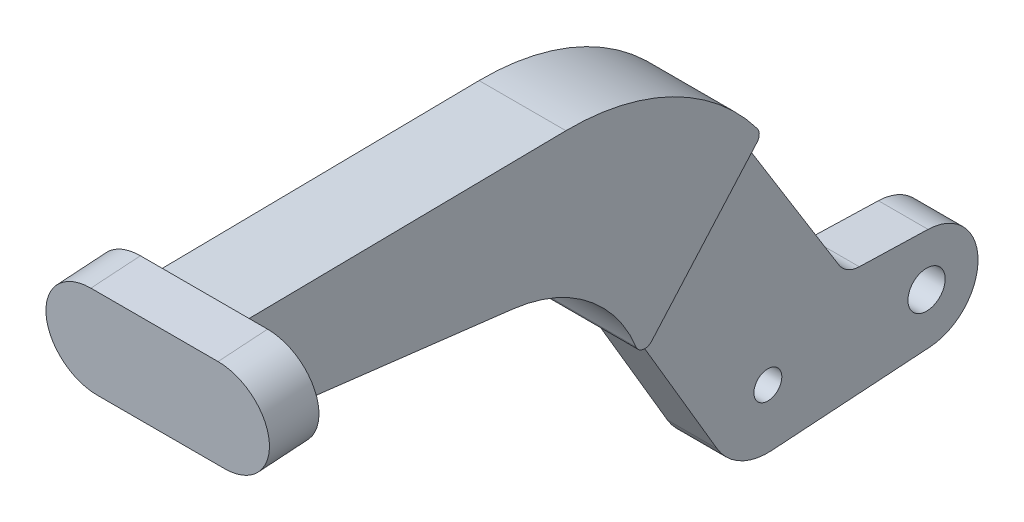
ISO-10303-21;
HEADER;
FILE_DESCRIPTION(('STEP AP214'),'2;1');
FILE_NAME('part.step','',(''),(''),'','','');
FILE_SCHEMA(('AUTOMOTIVE_DESIGN { 1 0 10303 214 1 1 1 1 }'));
ENDSEC;
DATA;
#1=APPLICATION_CONTEXT('core data for automotive mechanical design processes');
#2=APPLICATION_PROTOCOL_DEFINITION('international standard','automotive_design',2000,#1);
#3=PRODUCT_CONTEXT('',#1,'mechanical');
#4=PRODUCT('Part','Part','',(#3));
#5=PRODUCT_RELATED_PRODUCT_CATEGORY('part','',(#4));
#6=PRODUCT_DEFINITION_FORMATION('','',#4);
#7=PRODUCT_DEFINITION_CONTEXT('part definition',#1,'design');
#8=PRODUCT_DEFINITION('design','',#6,#7);
#9=PRODUCT_DEFINITION_SHAPE('','',#8);
#10=(LENGTH_UNIT() NAMED_UNIT(*) SI_UNIT(.MILLI.,.METRE.));
#11=(NAMED_UNIT(*) PLANE_ANGLE_UNIT() SI_UNIT($,.RADIAN.));
#12=(NAMED_UNIT(*) SI_UNIT($,.STERADIAN.) SOLID_ANGLE_UNIT());
#13=UNCERTAINTY_MEASURE_WITH_UNIT(LENGTH_MEASURE(1.E-05),#10,'distance_accuracy_value','');
#14=(GEOMETRIC_REPRESENTATION_CONTEXT(3) GLOBAL_UNCERTAINTY_ASSIGNED_CONTEXT((#13)) GLOBAL_UNIT_ASSIGNED_CONTEXT((#10,
#11,#12)) REPRESENTATION_CONTEXT('',''));
#15=CARTESIAN_POINT('',(0.,0.,0.));
#16=DIRECTION('',(0.,0.,1.));
#17=DIRECTION('',(1.,0.,0.));
#18=AXIS2_PLACEMENT_3D('',#15,#16,#17);
#19=CARTESIAN_POINT('',(18.,53.8241588460239,94.8922638422166));
#20=DIRECTION('',(0.,0.0664480485987355,-0.997789886117022));
#21=DIRECTION('',(0.,0.997789886117022,0.0664480485987355));
#22=AXIS2_PLACEMENT_3D('',#19,#20,#21);
#23=PLANE('',#22);
#24=DIRECTION('',(1.,0.,0.));
#25=VECTOR('',#24,1.);
#26=CARTESIAN_POINT('',(18.,53.8241588460239,94.8922638422166));
#27=LINE('',#26,#25);
#28=CARTESIAN_POINT('',(10.25,53.8241588460239,94.8922638422166));
#29=VERTEX_POINT('',#28);
#30=CARTESIAN_POINT('',(-10.25,53.8241588460239,94.8922638422166));
#31=VERTEX_POINT('',#30);
#32=EDGE_CURVE('E137',#29,#31,#27,.F.);
#33=ORIENTED_EDGE('',*,*,#32,.T.);
#34=CARTESIAN_POINT('',(-10.25,46.091287228617,94.3772914655764));
#35=DIRECTION('',(0.,0.0664480485987357,-0.997789886117022));
#36=DIRECTION('',(0.,0.997789886117022,0.0664480485987357));
#37=AXIS2_PLACEMENT_3D('',#34,#35,#36);
#38=CIRCLE('',#37,7.75);
#39=CARTESIAN_POINT('',(-10.2500000000001,38.3584156112101,93.8623190889362));
#40=VERTEX_POINT('',#39);
#41=EDGE_CURVE('E20',#40,#31,#38,.T.);
#42=ORIENTED_EDGE('',*,*,#41,.F.);
#43=DIRECTION('',(1.,0.,0.));
#44=VECTOR('',#43,1.);
#45=CARTESIAN_POINT('',(18.,38.3584156112101,93.8623190889362));
#46=LINE('',#45,#44);
#47=CARTESIAN_POINT('',(10.25,38.3584156112101,93.8623190889362));
#48=VERTEX_POINT('',#47);
#49=EDGE_CURVE('E160',#40,#48,#46,.T.);
#50=ORIENTED_EDGE('',*,*,#49,.T.);
#51=CARTESIAN_POINT('',(10.25,46.091287228617,94.3772914655764));
#52=DIRECTION('',(0.,0.0664480485987357,-0.997789886117022));
#53=DIRECTION('',(0.,0.997789886117022,0.0664480485987357));
#54=AXIS2_PLACEMENT_3D('',#51,#52,#53);
#55=CIRCLE('',#54,7.75);
#56=EDGE_CURVE('E140',#29,#48,#55,.T.);
#57=ORIENTED_EDGE('',*,*,#56,.F.);
#58=EDGE_LOOP('',(#33,#42,#50,#57));
#59=FACE_BOUND('',#58,.T.);
#60=ADVANCED_FACE('F17',(#59),#23,.F.);
#61=CARTESIAN_POINT('',(4.,18.3523413623572,21.841428929078));
#62=DIRECTION('',(0.,0.507688737887499,-0.861540565163474));
#63=DIRECTION('',(0.,0.861540565163474,0.507688737887499));
#64=AXIS2_PLACEMENT_3D('',#61,#62,#63);
#65=PLANE('',#64);
#66=DIRECTION('',(1.,0.,0.));
#67=VECTOR('',#66,1.);
#68=CARTESIAN_POINT('',(4.,-4.82019630341762,8.18631287664287));
#69=LINE('',#68,#67);
#70=CARTESIAN_POINT('',(4.,-4.82019630341762,8.18631287664286));
#71=VERTEX_POINT('',#70);
#72=CARTESIAN_POINT('',(-4.,-4.82019630341763,8.18631287664286));
#73=VERTEX_POINT('',#72);
#74=EDGE_CURVE('E262',#71,#73,#69,.F.);
#75=ORIENTED_EDGE('',*,*,#74,.F.);
#76=DIRECTION('',(0.,-0.861540565163473,-0.5076887378875));
#77=VECTOR('',#76,1.);
#78=CARTESIAN_POINT('',(4.,18.3523413623572,21.841428929078));
#79=LINE('',#78,#77);
#80=CARTESIAN_POINT('',(4.,18.3523413623572,21.841428929078));
#81=VERTEX_POINT('',#80);
#82=EDGE_CURVE('E222',#81,#71,#79,.T.);
#83=ORIENTED_EDGE('',*,*,#82,.F.);
#84=DIRECTION('',(1.,0.,0.));
#85=VECTOR('',#84,1.);
#86=CARTESIAN_POINT('',(4.,18.3523413623572,21.841428929078));
#87=LINE('',#86,#85);
#88=CARTESIAN_POINT('',(-4.,18.3523413623572,21.841428929078));
#89=VERTEX_POINT('',#88);
#90=EDGE_CURVE('E238',#81,#89,#87,.F.);
#91=ORIENTED_EDGE('',*,*,#90,.T.);
#92=DIRECTION('',(0.,-0.861540565163473,-0.5076887378875));
#93=VECTOR('',#92,1.);
#94=CARTESIAN_POINT('',(-4.,18.3523413623572,21.841428929078));
#95=LINE('',#94,#93);
#96=EDGE_CURVE('E237',#89,#73,#95,.T.);
#97=ORIENTED_EDGE('',*,*,#96,.T.);
#98=EDGE_LOOP('',(#75,#83,#91,#97));
#99=FACE_BOUND('',#98,.T.);
#100=ADVANCED_FACE('F464',(#99),#65,.F.);
#101=CARTESIAN_POINT('',(4.,0.00284670651361663,0.00167750758986018));
#102=DIRECTION('',(1.,0.,0.));
#103=DIRECTION('',(0.,0.,-1.));
#104=AXIS2_PLACEMENT_3D('',#101,#102,#103);
#105=CYLINDRICAL_SURFACE('',#104,9.5);
#106=CARTESIAN_POINT('',(4.,0.00284670651361663,0.00167750758986018));
#107=DIRECTION('',(1.,0.,0.));
#108=DIRECTION('',(0.,0.,-1.));
#109=AXIS2_PLACEMENT_3D('',#106,#107,#108);
#110=CIRCLE('',#109,9.5);
#111=CARTESIAN_POINT('',(4.,-9.47626724226086,-0.627924546210142));
#112=VERTEX_POINT('',#111);
#113=EDGE_CURVE('E219',#71,#112,#110,.T.);
#114=ORIENTED_EDGE('',*,*,#113,.F.);
#115=ORIENTED_EDGE('',*,*,#74,.T.);
#116=CARTESIAN_POINT('',(-4.,0.00284670651361663,0.00167750758986018));
#117=DIRECTION('',(1.,0.,0.));
#118=DIRECTION('',(0.,0.,-1.));
#119=AXIS2_PLACEMENT_3D('',#116,#117,#118);
#120=CIRCLE('',#119,9.5);
#121=CARTESIAN_POINT('',(-4.,-9.47626724226086,-0.627924546210142));
#122=VERTEX_POINT('',#121);
#123=EDGE_CURVE('E236',#73,#122,#120,.T.);
#124=ORIENTED_EDGE('',*,*,#123,.T.);
#125=DIRECTION('',(1.,0.,0.));
#126=VECTOR('',#125,1.);
#127=CARTESIAN_POINT('',(4.,-9.47626724226086,-0.627924546210141));
#128=LINE('',#127,#126);
#129=EDGE_CURVE('E260',#122,#112,#128,.T.);
#130=ORIENTED_EDGE('',*,*,#129,.T.);
#131=EDGE_LOOP('',(#114,#115,#124,#130));
#132=FACE_BOUND('',#131,.T.);
#133=ADVANCED_FACE('F468',(#132),#105,.T.);
#134=CARTESIAN_POINT('',(4.,-9.47626724226086,-0.627924546210142));
#135=DIRECTION('',(0.,0.99780146829205,0.0662739004000004));
#136=DIRECTION('',(0.,-0.0662739004000004,0.99780146829205));
#137=AXIS2_PLACEMENT_3D('',#134,#135,#136);
#138=PLANE('',#137);
#139=DIRECTION('',(1.,0.,0.));
#140=VECTOR('',#139,1.);
#141=CARTESIAN_POINT('',(4.,-7.78175218682402,-26.14007337332));
#142=LINE('',#141,#140);
#143=CARTESIAN_POINT('',(4.,-7.78175218682402,-26.14007337332));
#144=VERTEX_POINT('',#143);
#145=CARTESIAN_POINT('',(-4.,-7.78175218682402,-26.14007337332));
#146=VERTEX_POINT('',#145);
#147=EDGE_CURVE('E257',#144,#146,#142,.F.);
#148=ORIENTED_EDGE('',*,*,#147,.F.);
#149=DIRECTION('',(0.,0.0662739004000003,-0.99780146829205));
#150=VECTOR('',#149,1.);
#151=CARTESIAN_POINT('',(4.,-9.47626724226086,-0.627924546210143));
#152=LINE('',#151,#150);
#153=EDGE_CURVE('E218',#112,#144,#152,.T.);
#154=ORIENTED_EDGE('',*,*,#153,.F.);
#155=ORIENTED_EDGE('',*,*,#129,.F.);
#156=DIRECTION('',(0.,0.0662739004000003,-0.99780146829205));
#157=VECTOR('',#156,1.);
#158=CARTESIAN_POINT('',(-4.,-9.47626724226086,-0.627924546210141));
#159=LINE('',#158,#157);
#160=EDGE_CURVE('E235',#122,#146,#159,.T.);
#161=ORIENTED_EDGE('',*,*,#160,.T.);
#162=EDGE_LOOP('',(#148,#154,#155,#161));
#163=FACE_BOUND('',#162,.T.);
#164=ADVANCED_FACE('F472',(#163),#138,.F.);
#165=CARTESIAN_POINT('',(4.,0.499999999999999,-25.59));
#166=DIRECTION('',(1.,0.,0.));
#167=DIRECTION('',(0.,0.,-1.));
#168=AXIS2_PLACEMENT_3D('',#165,#166,#167);
#169=CYLINDRICAL_SURFACE('',#168,8.3);
#170=CARTESIAN_POINT('',(4.,0.499999999999999,-25.59));
#171=DIRECTION('',(1.,0.,0.));
#172=DIRECTION('',(0.,0.,-1.));
#173=AXIS2_PLACEMENT_3D('',#170,#171,#172);
#174=CIRCLE('',#173,8.3);
#175=CARTESIAN_POINT('',(4.,8.79651671805474,-25.8304378236431));
#176=VERTEX_POINT('',#175);
#177=EDGE_CURVE('E215',#144,#176,#174,.T.);
#178=ORIENTED_EDGE('',*,*,#177,.F.);
#179=ORIENTED_EDGE('',*,*,#147,.T.);
#180=CARTESIAN_POINT('',(-4.,0.499999999999999,-25.59));
#181=DIRECTION('',(1.,0.,0.));
#182=DIRECTION('',(0.,0.,-1.));
#183=AXIS2_PLACEMENT_3D('',#180,#181,#182);
#184=CIRCLE('',#183,8.3);
#185=CARTESIAN_POINT('',(-4.,8.79651671805474,-25.8304378236431));
#186=VERTEX_POINT('',#185);
#187=EDGE_CURVE('E233',#146,#186,#184,.T.);
#188=ORIENTED_EDGE('',*,*,#187,.T.);
#189=DIRECTION('',(1.,0.,0.));
#190=VECTOR('',#189,1.);
#191=CARTESIAN_POINT('',(4.,8.79651671805474,-25.8304378236431));
#192=LINE('',#191,#190);
#193=EDGE_CURVE('E255',#186,#176,#192,.T.);
#194=ORIENTED_EDGE('',*,*,#193,.T.);
#195=EDGE_LOOP('',(#178,#179,#188,#194));
#196=FACE_BOUND('',#195,.T.);
#197=ADVANCED_FACE('F476',(#196),#169,.T.);
#198=CARTESIAN_POINT('',(4.,8.79651671805474,-25.8304378236431));
#199=DIRECTION('',(0.,-0.999580327476475,0.0289684124871183));
#200=DIRECTION('',(0.,-0.0289684124871183,-0.999580327476475));
#201=AXIS2_PLACEMENT_3D('',#198,#199,#200);
#202=PLANE('',#201);
#203=DIRECTION('',(1.,0.,0.));
#204=VECTOR('',#203,1.);
#205=CARTESIAN_POINT('',(4.,9.1178198368181,-14.7435935992496));
#206=LINE('',#205,#204);
#207=CARTESIAN_POINT('',(-4.,9.1178198368181,-14.7435935992496));
#208=VERTEX_POINT('',#207);
#209=CARTESIAN_POINT('',(4.,9.1178198368181,-14.7435935992496));
#210=VERTEX_POINT('',#209);
#211=EDGE_CURVE('E143',#208,#210,#206,.T.);
#212=ORIENTED_EDGE('',*,*,#211,.T.);
#213=DIRECTION('',(0.,0.0289684124871216,0.999580327476475));
#214=VECTOR('',#213,1.);
#215=CARTESIAN_POINT('',(4.,8.79651671805474,-25.8304378236431));
#216=LINE('',#215,#214);
#217=EDGE_CURVE('E214',#176,#210,#216,.T.);
#218=ORIENTED_EDGE('',*,*,#217,.F.);
#219=ORIENTED_EDGE('',*,*,#193,.F.);
#220=DIRECTION('',(0.,0.0289684124871216,0.999580327476475));
#221=VECTOR('',#220,1.);
#222=CARTESIAN_POINT('',(-4.,8.79651671805474,-25.8304378236431));
#223=LINE('',#222,#221);
#224=EDGE_CURVE('E232',#186,#208,#223,.T.);
#225=ORIENTED_EDGE('',*,*,#224,.T.);
#226=EDGE_LOOP('',(#212,#218,#219,#225));
#227=FACE_BOUND('',#226,.T.);
#228=ADVANCED_FACE('F481',(#227),#202,.F.);
#229=CARTESIAN_POINT('',(4.,13.116141146724,-14.8594672491981));
#230=DIRECTION('',(1.,0.,0.));
#231=DIRECTION('',(0.,0.,-1.));
#232=AXIS2_PLACEMENT_3D('',#229,#230,#231);
#233=CYLINDRICAL_SURFACE('',#232,4.);
#234=DIRECTION('',(1.,0.,0.));
#235=VECTOR('',#234,1.);
#236=CARTESIAN_POINT('',(4.,11.0089113338698,-11.4595286444849));
#237=LINE('',#236,#235);
#238=CARTESIAN_POINT('',(-4.,11.0089113338696,-11.459528644485));
#239=VERTEX_POINT('',#238);
#240=CARTESIAN_POINT('',(4.,11.0089113338697,-11.459528644485));
#241=VERTEX_POINT('',#240);
#242=EDGE_CURVE('E226',#239,#241,#237,.T.);
#243=ORIENTED_EDGE('',*,*,#242,.T.);
#244=CARTESIAN_POINT('',(4.,13.116141146724,-14.8594672491981));
#245=DIRECTION('',(1.,0.,0.));
#246=DIRECTION('',(0.,0.,-1.));
#247=AXIS2_PLACEMENT_3D('',#244,#245,#246);
#248=CIRCLE('',#247,4.);
#249=EDGE_CURVE('E211',#210,#241,#248,.F.);
#250=ORIENTED_EDGE('',*,*,#249,.F.);
#251=ORIENTED_EDGE('',*,*,#211,.F.);
#252=CARTESIAN_POINT('',(-4.,13.116141146724,-14.8594672491981));
#253=DIRECTION('',(1.,0.,0.));
#254=DIRECTION('',(0.,0.,-1.));
#255=AXIS2_PLACEMENT_3D('',#252,#253,#254);
#256=CIRCLE('',#255,4.);
#257=EDGE_CURVE('E230',#208,#239,#256,.F.);
#258=ORIENTED_EDGE('',*,*,#257,.T.);
#259=EDGE_LOOP('',(#243,#250,#251,#258));
#260=FACE_BOUND('',#259,.T.);
#261=ADVANCED_FACE('F485',(#260),#233,.F.);
#262=CARTESIAN_POINT('',(4.,0.,0.));
#263=DIRECTION('',(-1.,0.,0.));
#264=DIRECTION('',(0.,0.,1.));
#265=AXIS2_PLACEMENT_3D('',#262,#263,#264);
#266=CYLINDRICAL_SURFACE('',#265,2.25);
#267=CARTESIAN_POINT('',(4.,0.,0.));
#268=DIRECTION('',(-1.,0.,0.));
#269=DIRECTION('',(0.,0.,1.));
#270=AXIS2_PLACEMENT_3D('',#267,#268,#269);
#271=CIRCLE('',#270,2.25);
#272=CARTESIAN_POINT('',(4.,0.,2.25));
#273=VERTEX_POINT('',#272);
#274=EDGE_CURVE('E207',#273,#273,#271,.T.);
#275=ORIENTED_EDGE('',*,*,#274,.F.);
#276=EDGE_LOOP('',(#275));
#277=FACE_BOUND('',#276,.T.);
#278=CARTESIAN_POINT('',(-4.,0.,0.));
#279=DIRECTION('',(-1.,0.,0.));
#280=DIRECTION('',(0.,0.,1.));
#281=AXIS2_PLACEMENT_3D('',#278,#279,#280);
#282=CIRCLE('',#281,2.25);
#283=CARTESIAN_POINT('',(-4.,0.,2.25));
#284=VERTEX_POINT('',#283);
#285=EDGE_CURVE('E227',#284,#284,#282,.T.);
#286=ORIENTED_EDGE('',*,*,#285,.T.);
#287=EDGE_LOOP('',(#286));
#288=FACE_BOUND('',#287,.T.);
#289=ADVANCED_FACE('F487',(#277,#288),#266,.F.);
#290=CARTESIAN_POINT('',(4.,0.5,-25.59));
#291=DIRECTION('',(-1.,0.,0.));
#292=DIRECTION('',(0.,0.,1.));
#293=AXIS2_PLACEMENT_3D('',#290,#291,#292);
#294=CYLINDRICAL_SURFACE('',#293,3.);
#295=CARTESIAN_POINT('',(4.,0.5,-25.59));
#296=DIRECTION('',(-1.,0.,0.));
#297=DIRECTION('',(0.,0.,1.));
#298=AXIS2_PLACEMENT_3D('',#295,#296,#297);
#299=CIRCLE('',#298,3.);
#300=CARTESIAN_POINT('',(4.,0.5,-22.59));
#301=VERTEX_POINT('',#300);
#302=EDGE_CURVE('E203',#301,#301,#299,.T.);
#303=ORIENTED_EDGE('',*,*,#302,.F.);
#304=EDGE_LOOP('',(#303));
#305=FACE_BOUND('',#304,.T.);
#306=CARTESIAN_POINT('',(-4.,0.5,-25.59));
#307=DIRECTION('',(-1.,0.,0.));
#308=DIRECTION('',(0.,0.,1.));
#309=AXIS2_PLACEMENT_3D('',#306,#307,#308);
#310=CIRCLE('',#309,3.);
#311=CARTESIAN_POINT('',(-4.,0.5,-22.59));
#312=VERTEX_POINT('',#311);
#313=EDGE_CURVE('E223',#312,#312,#310,.T.);
#314=ORIENTED_EDGE('',*,*,#313,.T.);
#315=EDGE_LOOP('',(#314));
#316=FACE_BOUND('',#315,.T.);
#317=ADVANCED_FACE('F493',(#305,#316),#294,.F.);
#318=CARTESIAN_POINT('',(18.,54.3557432348138,86.9099447532804));
#319=DIRECTION('',(0.,-0.997789886117022,-0.0664480485987363));
#320=DIRECTION('',(0.,0.0664480485987363,-0.997789886117022));
#321=AXIS2_PLACEMENT_3D('',#318,#319,#320);
#322=PLANE('',#321);
#323=DIRECTION('',(1.,0.,0.));
#324=VECTOR('',#323,1.);
#325=CARTESIAN_POINT('',(18.,54.3557432348138,86.9099447532804));
#326=LINE('',#325,#324);
#327=CARTESIAN_POINT('',(10.25,54.3557432348138,86.9099447532804));
#328=VERTEX_POINT('',#327);
#329=CARTESIAN_POINT('',(-10.25,54.3557432348138,86.9099447532804));
#330=VERTEX_POINT('',#329);
#331=EDGE_CURVE('E149',#328,#330,#326,.F.);
#332=ORIENTED_EDGE('',*,*,#331,.T.);
#333=DIRECTION('',(0.,0.0664480485987357,-0.997789886117022));
#334=VECTOR('',#333,1.);
#335=CARTESIAN_POINT('',(-10.25,54.3557432348138,86.9099447532804));
#336=LINE('',#335,#334);
#337=EDGE_CURVE('E146',#31,#330,#336,.T.);
#338=ORIENTED_EDGE('',*,*,#337,.F.);
#339=ORIENTED_EDGE('',*,*,#32,.F.);
#340=DIRECTION('',(0.,0.0664480485987357,-0.997789886117022));
#341=VECTOR('',#340,1.);
#342=CARTESIAN_POINT('',(10.25,54.3557432348138,86.9099447532804));
#343=LINE('',#342,#341);
#344=EDGE_CURVE('E167',#328,#29,#343,.F.);
#345=ORIENTED_EDGE('',*,*,#344,.F.);
#346=EDGE_LOOP('',(#332,#338,#339,#345));
#347=FACE_BOUND('',#346,.T.);
#348=ADVANCED_FACE('F147',(#347),#322,.F.);
#349=CARTESIAN_POINT('',(-10.25,46.6228716174069,86.3949723766402));
#350=DIRECTION('',(0.,0.0664480485987357,-0.997789886117022));
#351=DIRECTION('',(0.,0.997789886117022,0.0664480485987357));
#352=AXIS2_PLACEMENT_3D('',#349,#350,#351);
#353=CYLINDRICAL_SURFACE('',#352,7.75);
#354=ORIENTED_EDGE('',*,*,#41,.T.);
#355=ORIENTED_EDGE('',*,*,#337,.T.);
#356=CARTESIAN_POINT('',(-10.25,46.6228716174069,86.3949723766402));
#357=DIRECTION('',(0.,0.0664480485987357,-0.997789886117022));
#358=DIRECTION('',(0.,0.997789886117022,0.0664480485987357));
#359=AXIS2_PLACEMENT_3D('',#356,#357,#358);
#360=CIRCLE('',#359,7.75);
#361=CARTESIAN_POINT('',(-10.2500000000001,38.89,85.88));
#362=VERTEX_POINT('',#361);
#363=EDGE_CURVE('E157',#330,#362,#360,.F.);
#364=ORIENTED_EDGE('',*,*,#363,.T.);
#365=DIRECTION('',(0.,-0.0664480485987363,0.997789886117022));
#366=VECTOR('',#365,1.);
#367=CARTESIAN_POINT('',(-10.2500000000001,38.3584156112101,93.8623190889362));
#368=LINE('',#367,#366);
#369=EDGE_CURVE('E152',#362,#40,#368,.T.);
#370=ORIENTED_EDGE('',*,*,#369,.T.);
#371=EDGE_LOOP('',(#354,#355,#364,#370));
#372=FACE_BOUND('',#371,.T.);
#373=ADVANCED_FACE('F154',(#372),#353,.T.);
#374=CARTESIAN_POINT('',(18.,38.3584156112101,93.8623190889362));
#375=DIRECTION('',(0.,0.997789886117022,0.0664480485987363));
#376=DIRECTION('',(0.,-0.0664480485987363,0.997789886117022));
#377=AXIS2_PLACEMENT_3D('',#374,#375,#376);
#378=PLANE('',#377);
#379=DIRECTION('',(0.,0.0664480485987357,-0.997789886117022));
#380=VECTOR('',#379,1.);
#381=CARTESIAN_POINT('',(10.2500000000001,38.89,85.88));
#382=LINE('',#381,#380);
#383=CARTESIAN_POINT('',(10.25,38.89,85.88));
#384=VERTEX_POINT('',#383);
#385=EDGE_CURVE('E165',#48,#384,#382,.T.);
#386=ORIENTED_EDGE('',*,*,#385,.F.);
#387=ORIENTED_EDGE('',*,*,#49,.F.);
#388=ORIENTED_EDGE('',*,*,#369,.F.);
#389=DIRECTION('',(1.,0.,0.));
#390=VECTOR('',#389,1.);
#391=CARTESIAN_POINT('',(18.,38.89,85.88));
#392=LINE('',#391,#390);
#393=EDGE_CURVE('E201',#362,#384,#392,.T.);
#394=ORIENTED_EDGE('',*,*,#393,.T.);
#395=EDGE_LOOP('',(#386,#387,#388,#394));
#396=FACE_BOUND('',#395,.T.);
#397=ADVANCED_FACE('F163',(#396),#378,.F.);
#398=CARTESIAN_POINT('',(10.25,46.6228716174069,86.3949723766402));
#399=DIRECTION('',(0.,0.0664480485987357,-0.997789886117022));
#400=DIRECTION('',(0.,0.997789886117022,0.0664480485987357));
#401=AXIS2_PLACEMENT_3D('',#398,#399,#400);
#402=CYLINDRICAL_SURFACE('',#401,7.75);
#403=ORIENTED_EDGE('',*,*,#344,.T.);
#404=ORIENTED_EDGE('',*,*,#56,.T.);
#405=ORIENTED_EDGE('',*,*,#385,.T.);
#406=CARTESIAN_POINT('',(10.25,46.6228716174069,86.3949723766402));
#407=DIRECTION('',(0.,0.0664480485987357,-0.997789886117022));
#408=DIRECTION('',(0.,0.997789886117022,0.0664480485987357));
#409=AXIS2_PLACEMENT_3D('',#406,#407,#408);
#410=CIRCLE('',#409,7.75);
#411=EDGE_CURVE('E197',#384,#328,#410,.F.);
#412=ORIENTED_EDGE('',*,*,#411,.T.);
#413=EDGE_LOOP('',(#403,#404,#405,#412));
#414=FACE_BOUND('',#413,.T.);
#415=ADVANCED_FACE('F381',(#414),#402,.T.);
#416=CARTESIAN_POINT('',(4.,37.4968801440663,4.9573082599917));
#417=DIRECTION('',(0.,-0.661442774329838,-0.749995637511877));
#418=DIRECTION('',(0.,0.749995637511877,-0.661442774329838));
#419=AXIS2_PLACEMENT_3D('',#416,#417,#418);
#420=PLANE('',#419);
#421=DIRECTION('',(0.,-0.749995637511898,0.661442774329814));
#422=VECTOR('',#421,1.);
#423=CARTESIAN_POINT('',(-4.,18.4814248513396,21.7275864787993));
#424=LINE('',#423,#422);
#425=CARTESIAN_POINT('',(-4.,18.4814248513396,21.7275864787993));
#426=VERTEX_POINT('',#425);
#427=EDGE_CURVE('E241',#426,#89,#424,.T.);
#428=ORIENTED_EDGE('',*,*,#427,.T.);
#429=ORIENTED_EDGE('',*,*,#90,.F.);
#430=DIRECTION('',(0.,-0.749995637511898,0.661442774329814));
#431=VECTOR('',#430,1.);
#432=CARTESIAN_POINT('',(4.,18.4814248513396,21.7275864787993));
#433=LINE('',#432,#431);
#434=CARTESIAN_POINT('',(4.,18.4814248513396,21.7275864787993));
#435=VERTEX_POINT('',#434);
#436=EDGE_CURVE('E268',#435,#81,#433,.T.);
#437=ORIENTED_EDGE('',*,*,#436,.F.);
#438=DIRECTION('',(1.,0.,0.));
#439=VECTOR('',#438,1.);
#440=CARTESIAN_POINT('',(7.,18.4814248513396,21.7275864787993));
#441=LINE('',#440,#439);
#442=EDGE_CURVE('E192',#426,#435,#441,.T.);
#443=ORIENTED_EDGE('',*,*,#442,.F.);
#444=EDGE_LOOP('',(#428,#429,#437,#443));
#445=FACE_BOUND('',#444,.T.);
#446=ADVANCED_FACE('F462',(#445),#420,.F.);
#447=CARTESIAN_POINT('',(-4.,0.00284670651361663,0.00167750758986018));
#448=DIRECTION('',(1.,0.,0.));
#449=DIRECTION('',(0.,0.,-1.));
#450=AXIS2_PLACEMENT_3D('',#447,#448,#449);
#451=PLANE('',#450);
#452=ORIENTED_EDGE('',*,*,#313,.F.);
#453=EDGE_LOOP('',(#452));
#454=FACE_BOUND('',#453,.T.);
#455=ORIENTED_EDGE('',*,*,#285,.F.);
#456=EDGE_LOOP('',(#455));
#457=FACE_BOUND('',#456,.T.);
#458=DIRECTION('',(0.,-0.84998465117823,-0.526807453213622));
#459=VECTOR('',#458,1.);
#460=CARTESIAN_POINT('',(-4.,11.0089113338695,-11.4595286444851));
#461=LINE('',#460,#459);
#462=CARTESIAN_POINT('',(-4.,37.4968801440663,4.95730825999169));
#463=VERTEX_POINT('',#462);
#464=EDGE_CURVE('E247',#463,#239,#461,.T.);
#465=ORIENTED_EDGE('',*,*,#464,.T.);
#466=ORIENTED_EDGE('',*,*,#257,.F.);
#467=ORIENTED_EDGE('',*,*,#224,.F.);
#468=ORIENTED_EDGE('',*,*,#187,.F.);
#469=ORIENTED_EDGE('',*,*,#160,.F.);
#470=ORIENTED_EDGE('',*,*,#123,.F.);
#471=ORIENTED_EDGE('',*,*,#96,.F.);
#472=ORIENTED_EDGE('',*,*,#427,.F.);
#473=DIRECTION('',(0.,-0.749995637511876,0.661442774329839));
#474=VECTOR('',#473,1.);
#475=CARTESIAN_POINT('',(-4.,18.4814248513396,21.7275864787993));
#476=LINE('',#475,#474);
#477=EDGE_CURVE('E251',#426,#463,#476,.F.);
#478=ORIENTED_EDGE('',*,*,#477,.T.);
#479=EDGE_LOOP('',(#465,#466,#467,#468,#469,#470,#471,#472,#478));
#480=FACE_BOUND('',#479,.T.);
#481=ADVANCED_FACE('F447',(#454,#457,#480),#451,.F.);
#482=CARTESIAN_POINT('',(4.,11.0089113338695,-11.4595286444851));
#483=DIRECTION('',(0.,-0.526807453213622,0.84998465117823));
#484=DIRECTION('',(0.,-0.84998465117823,-0.526807453213622));
#485=AXIS2_PLACEMENT_3D('',#482,#483,#484);
#486=PLANE('',#485);
#487=DIRECTION('',(1.,0.,0.));
#488=VECTOR('',#487,1.);
#489=CARTESIAN_POINT('',(7.,37.4968801440663,4.95730825999167));
#490=LINE('',#489,#488);
#491=CARTESIAN_POINT('',(4.,37.4968801440663,4.9573082599917));
#492=VERTEX_POINT('',#491);
#493=EDGE_CURVE('E248',#463,#492,#490,.T.);
#494=ORIENTED_EDGE('',*,*,#493,.T.);
#495=DIRECTION('',(0.,0.849984651178229,0.526807453213624));
#496=VECTOR('',#495,1.);
#497=CARTESIAN_POINT('',(4.,11.0089113338698,-11.459528644485));
#498=LINE('',#497,#496);
#499=EDGE_CURVE('E210',#241,#492,#498,.T.);
#500=ORIENTED_EDGE('',*,*,#499,.F.);
#501=ORIENTED_EDGE('',*,*,#242,.F.);
#502=ORIENTED_EDGE('',*,*,#464,.F.);
#503=EDGE_LOOP('',(#494,#500,#501,#502));
#504=FACE_BOUND('',#503,.T.);
#505=ADVANCED_FACE('F453',(#504),#486,.F.);
#506=CARTESIAN_POINT('',(4.,0.00284670651361663,0.00167750758986018));
#507=DIRECTION('',(1.,0.,0.));
#508=DIRECTION('',(0.,0.,-1.));
#509=AXIS2_PLACEMENT_3D('',#506,#507,#508);
#510=PLANE('',#509);
#511=ORIENTED_EDGE('',*,*,#302,.T.);
#512=EDGE_LOOP('',(#511));
#513=FACE_BOUND('',#512,.T.);
#514=ORIENTED_EDGE('',*,*,#274,.T.);
#515=EDGE_LOOP('',(#514));
#516=FACE_BOUND('',#515,.T.);
#517=ORIENTED_EDGE('',*,*,#249,.T.);
#518=ORIENTED_EDGE('',*,*,#499,.T.);
#519=DIRECTION('',(0.,-0.749995637511876,0.661442774329839));
#520=VECTOR('',#519,1.);
#521=CARTESIAN_POINT('',(4.,18.4814248513396,21.7275864787993));
#522=LINE('',#521,#520);
#523=EDGE_CURVE('E188',#492,#435,#522,.T.);
#524=ORIENTED_EDGE('',*,*,#523,.T.);
#525=ORIENTED_EDGE('',*,*,#436,.T.);
#526=ORIENTED_EDGE('',*,*,#82,.T.);
#527=ORIENTED_EDGE('',*,*,#113,.T.);
#528=ORIENTED_EDGE('',*,*,#153,.T.);
#529=ORIENTED_EDGE('',*,*,#177,.T.);
#530=ORIENTED_EDGE('',*,*,#217,.T.);
#531=EDGE_LOOP('',(#517,#518,#524,#525,#526,#527,#528,#529,#530));
#532=FACE_BOUND('',#531,.T.);
#533=ADVANCED_FACE('F351',(#513,#516,#532),#510,.T.);
#534=CARTESIAN_POINT('',(-7.,9.80999999999999,46.99));
#535=DIRECTION('',(1.,0.,0.));
#536=DIRECTION('',(0.,0.,-1.));
#537=AXIS2_PLACEMENT_3D('',#534,#535,#536);
#538=PLANE('',#537);
#539=DIRECTION('',(0.,0.013373620933191,-0.999910569132628));
#540=VECTOR('',#539,1.);
#541=CARTESIAN_POINT('',(-7.,54.7666016270398,35.5581975954613));
#542=LINE('',#541,#540);
#543=CARTESIAN_POINT('',(-7.00000000000002,54.0800269835661,86.8915833656603));
#544=VERTEX_POINT('',#543);
#545=CARTESIAN_POINT('',(-7.,54.7666016270398,35.5581975954612));
#546=VERTEX_POINT('',#545);
#547=EDGE_CURVE('E206',#544,#546,#542,.T.);
#548=ORIENTED_EDGE('',*,*,#547,.T.);
#549=CARTESIAN_POINT('',(-7.,16.77,35.05));
#550=DIRECTION('',(1.,0.,0.));
#551=DIRECTION('',(0.,0.,-1.));
#552=AXIS2_PLACEMENT_3D('',#549,#550,#551);
#553=CIRCLE('',#552,38.);
#554=CARTESIAN_POINT('',(-7.,39.6163528447674,4.68481991338782));
#555=VERTEX_POINT('',#554);
#556=EDGE_CURVE('E181',#555,#546,#553,.T.);
#557=ORIENTED_EDGE('',*,*,#556,.F.);
#558=CARTESIAN_POINT('',(-7.,38.7145231272108,5.8834454431225));
#559=DIRECTION('',(1.,0.,0.));
#560=DIRECTION('',(0.,0.,-1.));
#561=AXIS2_PLACEMENT_3D('',#558,#559,#560);
#562=CIRCLE('',#561,1.5);
#563=CARTESIAN_POINT('',(-7.,37.722358965716,4.75845198685469));
#564=VERTEX_POINT('',#563);
#565=EDGE_CURVE('E186',#564,#555,#562,.T.);
#566=ORIENTED_EDGE('',*,*,#565,.F.);
#567=DIRECTION('',(0.,-0.749995637511876,0.661442774329839));
#568=VECTOR('',#567,1.);
#569=CARTESIAN_POINT('',(-7.,18.4814248513396,21.7275864787993));
#570=LINE('',#569,#568);
#571=CARTESIAN_POINT('',(-7.,18.4814248513396,21.7275864787993));
#572=VERTEX_POINT('',#571);
#573=EDGE_CURVE('E323',#564,#572,#570,.T.);
#574=ORIENTED_EDGE('',*,*,#573,.T.);
#575=CARTESIAN_POINT('',(-7.,19.4735890128344,22.8525799350671));
#576=DIRECTION('',(1.,0.,0.));
#577=DIRECTION('',(0.,0.,-1.));
#578=AXIS2_PLACEMENT_3D('',#575,#576,#577);
#579=CIRCLE('',#578,1.49999999999999);
#580=CARTESIAN_POINT('',(-7.,18.916074262094,24.2451234003517));
#581=VERTEX_POINT('',#580);
#582=EDGE_CURVE('E189',#581,#572,#579,.T.);
#583=ORIENTED_EDGE('',*,*,#582,.F.);
#584=CARTESIAN_POINT('',(-7.,9.80999999999999,46.99));
#585=DIRECTION('',(1.,0.,0.));
#586=DIRECTION('',(0.,0.,-1.));
#587=AXIS2_PLACEMENT_3D('',#584,#585,#586);
#588=CIRCLE('',#587,24.5);
#589=CARTESIAN_POINT('',(-7.,34.1351363162037,44.0680583171273));
#590=VERTEX_POINT('',#589);
#591=EDGE_CURVE('E193',#581,#590,#588,.T.);
#592=ORIENTED_EDGE('',*,*,#591,.T.);
#593=DIRECTION('',(0.,0.11926292583154,0.992862706783823));
#594=VECTOR('',#593,1.);
#595=CARTESIAN_POINT('',(-7.,39.16,85.9));
#596=LINE('',#595,#594);
#597=CARTESIAN_POINT('',(-7.,39.1597554866985,85.8979644291241));
#598=VERTEX_POINT('',#597);
#599=EDGE_CURVE('E296',#590,#598,#596,.T.);
#600=ORIENTED_EDGE('',*,*,#599,.T.);
#601=DIRECTION('',(0.,-0.997789886117022,-0.0664480485987355));
#602=VECTOR('',#601,1.);
#603=CARTESIAN_POINT('',(-7.00000000000001,38.89,85.88));
#604=LINE('',#603,#602);
#605=EDGE_CURVE('E200',#598,#544,#604,.F.);
#606=ORIENTED_EDGE('',*,*,#605,.T.);
#607=EDGE_LOOP('',(#548,#557,#566,#574,#583,#592,#600,#606));
#608=FACE_BOUND('',#607,.T.);
#609=ADVANCED_FACE('F396',(#608),#538,.F.);
#610=CARTESIAN_POINT('',(7.,54.7666016270398,35.5581975954613));
#611=DIRECTION('',(0.,-0.999910569132628,-0.013373620933191));
#612=DIRECTION('',(0.,0.013373620933191,-0.999910569132628));
#613=AXIS2_PLACEMENT_3D('',#610,#611,#612);
#614=PLANE('',#613);
#615=DIRECTION('',(0.,-0.013373620933193,0.999910569132628));
#616=VECTOR('',#615,1.);
#617=CARTESIAN_POINT('',(7.,54.7666016270399,35.5581975954608));
#618=LINE('',#617,#616);
#619=CARTESIAN_POINT('',(7.,54.7666016270399,35.5581975954613));
#620=VERTEX_POINT('',#619);
#621=CARTESIAN_POINT('',(7.,54.080026983566,86.8915833656603));
#622=VERTEX_POINT('',#621);
#623=EDGE_CURVE('E377',#620,#622,#618,.T.);
#624=ORIENTED_EDGE('',*,*,#623,.F.);
#625=DIRECTION('',(1.,0.,0.));
#626=VECTOR('',#625,1.);
#627=CARTESIAN_POINT('',(7.,54.7666016270398,35.5581975954612));
#628=LINE('',#627,#626);
#629=EDGE_CURVE('E184',#546,#620,#628,.T.);
#630=ORIENTED_EDGE('',*,*,#629,.F.);
#631=ORIENTED_EDGE('',*,*,#547,.F.);
#632=DIRECTION('',(1.,0.,0.));
#633=VECTOR('',#632,1.);
#634=CARTESIAN_POINT('',(18.,54.0800269835661,86.8915833656603));
#635=LINE('',#634,#633);
#636=EDGE_CURVE('E300',#544,#622,#635,.T.);
#637=ORIENTED_EDGE('',*,*,#636,.T.);
#638=EDGE_LOOP('',(#624,#630,#631,#637));
#639=FACE_BOUND('',#638,.T.);
#640=ADVANCED_FACE('F385',(#639),#614,.F.);
#641=CARTESIAN_POINT('',(18.,38.89,85.88));
#642=DIRECTION('',(0.,-0.0664480485987355,0.997789886117022));
#643=DIRECTION('',(0.,-0.997789886117022,-0.0664480485987355));
#644=AXIS2_PLACEMENT_3D('',#641,#642,#643);
#645=PLANE('',#644);
#646=ORIENTED_EDGE('',*,*,#636,.F.);
#647=ORIENTED_EDGE('',*,*,#605,.F.);
#648=DIRECTION('',(1.,0.,0.));
#649=VECTOR('',#648,1.);
#650=CARTESIAN_POINT('',(7.,39.1597554866985,85.8979644291241));
#651=LINE('',#650,#649);
#652=CARTESIAN_POINT('',(7.,39.1597554866985,85.8979644291241));
#653=VERTEX_POINT('',#652);
#654=EDGE_CURVE('E299',#598,#653,#651,.T.);
#655=ORIENTED_EDGE('',*,*,#654,.T.);
#656=DIRECTION('',(0.,-0.997789886117022,-0.0664480485987348));
#657=VECTOR('',#656,1.);
#658=CARTESIAN_POINT('',(7.,54.080026983566,86.8915833656603));
#659=LINE('',#658,#657);
#660=EDGE_CURVE('E374',#622,#653,#659,.T.);
#661=ORIENTED_EDGE('',*,*,#660,.F.);
#662=EDGE_LOOP('',(#646,#647,#655,#661));
#663=FACE_BOUND('',#662,.T.);
#664=ORIENTED_EDGE('',*,*,#393,.F.);
#665=ORIENTED_EDGE('',*,*,#363,.F.);
#666=ORIENTED_EDGE('',*,*,#331,.F.);
#667=ORIENTED_EDGE('',*,*,#411,.F.);
#668=EDGE_LOOP('',(#664,#665,#666,#667));
#669=FACE_BOUND('',#668,.T.);
#670=ADVANCED_FACE('F382',(#663,#669),#645,.F.);
#671=CARTESIAN_POINT('',(7.,39.16,85.9));
#672=DIRECTION('',(0.,0.992862706783823,-0.11926292583154));
#673=DIRECTION('',(0.,0.11926292583154,0.992862706783823));
#674=AXIS2_PLACEMENT_3D('',#671,#672,#673);
#675=PLANE('',#674);
#676=ORIENTED_EDGE('',*,*,#599,.F.);
#677=DIRECTION('',(1.,0.,0.));
#678=VECTOR('',#677,1.);
#679=CARTESIAN_POINT('',(7.,34.1351363162037,44.0680583171273));
#680=LINE('',#679,#678);
#681=CARTESIAN_POINT('',(7.,34.1351363162037,44.0680583171273));
#682=VERTEX_POINT('',#681);
#683=EDGE_CURVE('E196',#590,#682,#680,.T.);
#684=ORIENTED_EDGE('',*,*,#683,.T.);
#685=DIRECTION('',(0.,-0.11926292583154,-0.992862706783823));
#686=VECTOR('',#685,1.);
#687=CARTESIAN_POINT('',(7.,39.1597554866985,85.8979644291241));
#688=LINE('',#687,#686);
#689=EDGE_CURVE('E180',#653,#682,#688,.T.);
#690=ORIENTED_EDGE('',*,*,#689,.F.);
#691=ORIENTED_EDGE('',*,*,#654,.F.);
#692=EDGE_LOOP('',(#676,#684,#690,#691));
#693=FACE_BOUND('',#692,.T.);
#694=ADVANCED_FACE('F384',(#693),#675,.F.);
#695=CARTESIAN_POINT('',(7.,9.80999999999999,46.99));
#696=DIRECTION('',(1.,0.,0.));
#697=DIRECTION('',(0.,0.,-1.));
#698=AXIS2_PLACEMENT_3D('',#695,#696,#697);
#699=CYLINDRICAL_SURFACE('',#698,24.5);
#700=DIRECTION('',(1.,0.,0.));
#701=VECTOR('',#700,1.);
#702=CARTESIAN_POINT('',(7.,18.916074262094,24.2451234003517));
#703=LINE('',#702,#701);
#704=CARTESIAN_POINT('',(7.,18.916074262094,24.2451234003517));
#705=VERTEX_POINT('',#704);
#706=EDGE_CURVE('E347',#705,#581,#703,.F.);
#707=ORIENTED_EDGE('',*,*,#706,.F.);
#708=CARTESIAN_POINT('',(7.,9.80999999999999,46.99));
#709=DIRECTION('',(1.,0.,0.));
#710=DIRECTION('',(0.,0.,-1.));
#711=AXIS2_PLACEMENT_3D('',#708,#709,#710);
#712=CIRCLE('',#711,24.5);
#713=EDGE_CURVE('E177',#682,#705,#712,.F.);
#714=ORIENTED_EDGE('',*,*,#713,.F.);
#715=ORIENTED_EDGE('',*,*,#683,.F.);
#716=ORIENTED_EDGE('',*,*,#591,.F.);
#717=EDGE_LOOP('',(#707,#714,#715,#716));
#718=FACE_BOUND('',#717,.T.);
#719=ADVANCED_FACE('F393',(#718),#699,.F.);
#720=CARTESIAN_POINT('',(7.,19.4735890128344,22.8525799350671));
#721=DIRECTION('',(1.,0.,0.));
#722=DIRECTION('',(0.,0.,-1.));
#723=AXIS2_PLACEMENT_3D('',#720,#721,#722);
#724=CYLINDRICAL_SURFACE('',#723,1.49999999999999);
#725=CARTESIAN_POINT('',(7.,19.4735890128344,22.8525799350671));
#726=DIRECTION('',(1.,0.,0.));
#727=DIRECTION('',(0.,0.,-1.));
#728=AXIS2_PLACEMENT_3D('',#725,#726,#727);
#729=CIRCLE('',#728,1.49999999999999);
#730=CARTESIAN_POINT('',(7.,18.4814248513396,21.7275864787993));
#731=VERTEX_POINT('',#730);
#732=EDGE_CURVE('E174',#705,#731,#729,.T.);
#733=ORIENTED_EDGE('',*,*,#732,.F.);
#734=ORIENTED_EDGE('',*,*,#706,.T.);
#735=ORIENTED_EDGE('',*,*,#582,.T.);
#736=DIRECTION('',(1.,0.,0.));
#737=VECTOR('',#736,1.);
#738=CARTESIAN_POINT('',(7.,18.4814248513396,21.7275864787993));
#739=LINE('',#738,#737);
#740=EDGE_CURVE('E293',#572,#426,#739,.T.);
#741=ORIENTED_EDGE('',*,*,#740,.T.);
#742=ORIENTED_EDGE('',*,*,#442,.T.);
#743=DIRECTION('',(1.,0.,0.));
#744=VECTOR('',#743,1.);
#745=CARTESIAN_POINT('',(7.,18.4814248513396,21.7275864787993));
#746=LINE('',#745,#744);
#747=EDGE_CURVE('E325',#435,#731,#746,.T.);
#748=ORIENTED_EDGE('',*,*,#747,.T.);
#749=EDGE_LOOP('',(#733,#734,#735,#741,#742,#748));
#750=FACE_BOUND('',#749,.T.);
#751=ADVANCED_FACE('F414',(#750),#724,.T.);
#752=CARTESIAN_POINT('',(7.,18.4814248513396,21.7275864787993));
#753=DIRECTION('',(0.,0.661442774329839,0.749995637511876));
#754=DIRECTION('',(0.,-0.749995637511876,0.661442774329839));
#755=AXIS2_PLACEMENT_3D('',#752,#753,#754);
#756=PLANE('',#755);
#757=ORIENTED_EDGE('',*,*,#493,.F.);
#758=ORIENTED_EDGE('',*,*,#477,.F.);
#759=ORIENTED_EDGE('',*,*,#740,.F.);
#760=ORIENTED_EDGE('',*,*,#573,.F.);
#761=DIRECTION('',(1.,0.,0.));
#762=VECTOR('',#761,1.);
#763=CARTESIAN_POINT('',(7.,37.722358965716,4.75845198685471));
#764=LINE('',#763,#762);
#765=CARTESIAN_POINT('',(7.,37.722358965716,4.75845198685469));
#766=VERTEX_POINT('',#765);
#767=EDGE_CURVE('E185',#766,#564,#764,.F.);
#768=ORIENTED_EDGE('',*,*,#767,.F.);
#769=DIRECTION('',(0.,0.749995637511876,-0.661442774329839));
#770=VECTOR('',#769,1.);
#771=CARTESIAN_POINT('',(7.,18.4814248513397,21.7275864787992));
#772=LINE('',#771,#770);
#773=EDGE_CURVE('E173',#731,#766,#772,.T.);
#774=ORIENTED_EDGE('',*,*,#773,.F.);
#775=ORIENTED_EDGE('',*,*,#747,.F.);
#776=ORIENTED_EDGE('',*,*,#523,.F.);
#777=EDGE_LOOP('',(#757,#758,#759,#760,#768,#774,#775,#776));
#778=FACE_BOUND('',#777,.T.);
#779=ADVANCED_FACE('F357',(#778),#756,.F.);
#780=CARTESIAN_POINT('',(7.,38.7145231272108,5.8834454431225));
#781=DIRECTION('',(1.,0.,0.));
#782=DIRECTION('',(0.,0.,-1.));
#783=AXIS2_PLACEMENT_3D('',#780,#781,#782);
#784=CYLINDRICAL_SURFACE('',#783,1.5);
#785=CARTESIAN_POINT('',(7.,38.7145231272108,5.8834454431225));
#786=DIRECTION('',(1.,0.,0.));
#787=DIRECTION('',(0.,0.,-1.));
#788=AXIS2_PLACEMENT_3D('',#785,#786,#787);
#789=CIRCLE('',#788,1.5);
#790=CARTESIAN_POINT('',(7.,39.6163528447674,4.68481991338782));
#791=VERTEX_POINT('',#790);
#792=EDGE_CURVE('E26',#766,#791,#789,.T.);
#793=ORIENTED_EDGE('',*,*,#792,.F.);
#794=ORIENTED_EDGE('',*,*,#767,.T.);
#795=ORIENTED_EDGE('',*,*,#565,.T.);
#796=DIRECTION('',(1.,0.,0.));
#797=VECTOR('',#796,1.);
#798=CARTESIAN_POINT('',(7.,39.6163528447674,4.68481991338782));
#799=LINE('',#798,#797);
#800=EDGE_CURVE('E35',#791,#555,#799,.F.);
#801=ORIENTED_EDGE('',*,*,#800,.F.);
#802=EDGE_LOOP('',(#793,#794,#795,#801));
#803=FACE_BOUND('',#802,.T.);
#804=ADVANCED_FACE('F406',(#803),#784,.T.);
#805=CARTESIAN_POINT('',(7.,16.77,35.05));
#806=DIRECTION('',(1.,0.,0.));
#807=DIRECTION('',(0.,0.,-1.));
#808=AXIS2_PLACEMENT_3D('',#805,#806,#807);
#809=CYLINDRICAL_SURFACE('',#808,38.);
#810=CARTESIAN_POINT('',(7.,16.77,35.05));
#811=DIRECTION('',(1.,0.,0.));
#812=DIRECTION('',(0.,0.,-1.));
#813=AXIS2_PLACEMENT_3D('',#810,#811,#812);
#814=CIRCLE('',#813,38.);
#815=EDGE_CURVE('E11',#791,#620,#814,.T.);
#816=ORIENTED_EDGE('',*,*,#815,.F.);
#817=ORIENTED_EDGE('',*,*,#800,.T.);
#818=ORIENTED_EDGE('',*,*,#556,.T.);
#819=ORIENTED_EDGE('',*,*,#629,.T.);
#820=EDGE_LOOP('',(#816,#817,#818,#819));
#821=FACE_BOUND('',#820,.T.);
#822=ADVANCED_FACE('F400',(#821),#809,.T.);
#823=CARTESIAN_POINT('',(7.,9.80999999999999,46.99));
#824=DIRECTION('',(1.,0.,0.));
#825=DIRECTION('',(0.,0.,-1.));
#826=AXIS2_PLACEMENT_3D('',#823,#824,#825);
#827=PLANE('',#826);
#828=ORIENTED_EDGE('',*,*,#792,.T.);
#829=ORIENTED_EDGE('',*,*,#815,.T.);
#830=ORIENTED_EDGE('',*,*,#623,.T.);
#831=ORIENTED_EDGE('',*,*,#660,.T.);
#832=ORIENTED_EDGE('',*,*,#689,.T.);
#833=ORIENTED_EDGE('',*,*,#713,.T.);
#834=ORIENTED_EDGE('',*,*,#732,.T.);
#835=ORIENTED_EDGE('',*,*,#773,.T.);
#836=EDGE_LOOP('',(#828,#829,#830,#831,#832,#833,#834,#835));
#837=FACE_BOUND('',#836,.T.);
#838=ADVANCED_FACE('F398',(#837),#827,.T.);
#839=CLOSED_SHELL('',(#60,#100,#133,#164,#197,#228,#261,#289,#317,#348,#373,#397,#415,#446,#481,
#505,#533,#609,#640,#670,#694,#719,#751,#779,#804,#822,#838));
#840=MANIFOLD_SOLID_BREP('B1',#839);
#841=ADVANCED_BREP_SHAPE_REPRESENTATION('',(#18,#840),#14);
#842=SHAPE_DEFINITION_REPRESENTATION(#9,#841);
ENDSEC;
END-ISO-10303-21;
